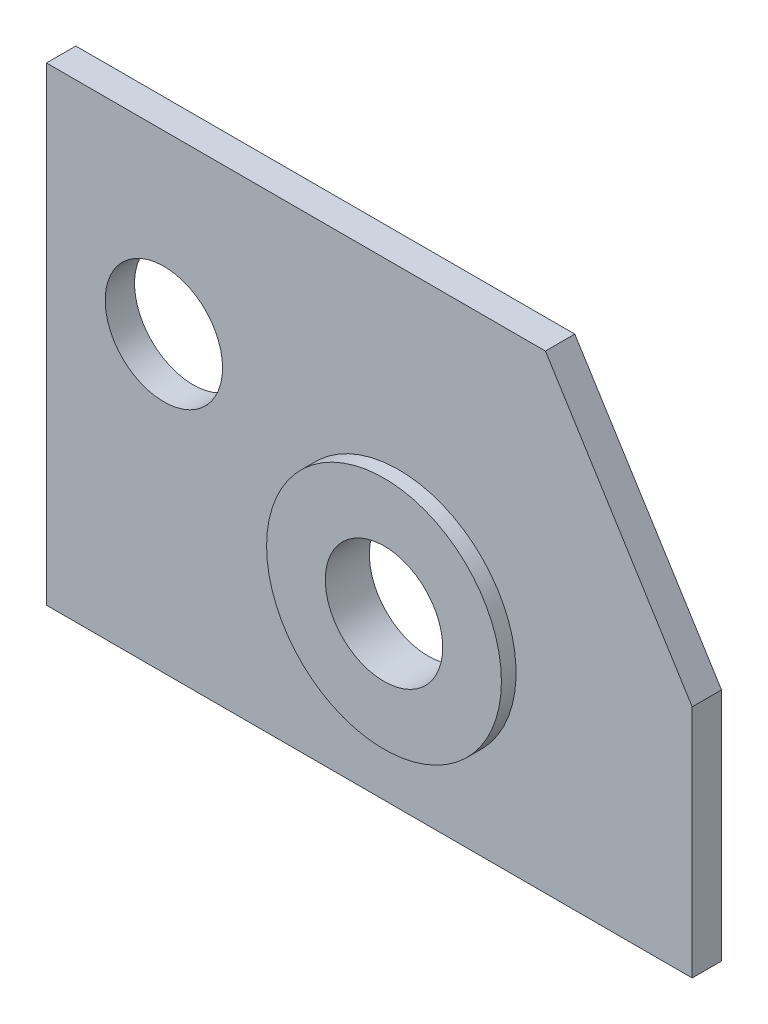
ISO-10303-21;
HEADER;
FILE_DESCRIPTION(('STEP AP214'),'2;1');
FILE_NAME('part.step','',(''),(''),'','','');
FILE_SCHEMA(('AUTOMOTIVE_DESIGN { 1 0 10303 214 1 1 1 1 }'));
ENDSEC;
DATA;
#1=APPLICATION_CONTEXT('core data for automotive mechanical design processes');
#2=APPLICATION_PROTOCOL_DEFINITION('international standard','automotive_design',2000,#1);
#3=PRODUCT_CONTEXT('',#1,'mechanical');
#4=PRODUCT('Part','Part','',(#3));
#5=PRODUCT_RELATED_PRODUCT_CATEGORY('part','',(#4));
#6=PRODUCT_DEFINITION_FORMATION('','',#4);
#7=PRODUCT_DEFINITION_CONTEXT('part definition',#1,'design');
#8=PRODUCT_DEFINITION('design','',#6,#7);
#9=PRODUCT_DEFINITION_SHAPE('','',#8);
#10=(LENGTH_UNIT() NAMED_UNIT(*) SI_UNIT(.MILLI.,.METRE.));
#11=(NAMED_UNIT(*) PLANE_ANGLE_UNIT() SI_UNIT($,.RADIAN.));
#12=(NAMED_UNIT(*) SI_UNIT($,.STERADIAN.) SOLID_ANGLE_UNIT());
#13=UNCERTAINTY_MEASURE_WITH_UNIT(LENGTH_MEASURE(1.E-05),#10,'distance_accuracy_value','');
#14=(GEOMETRIC_REPRESENTATION_CONTEXT(3) GLOBAL_UNCERTAINTY_ASSIGNED_CONTEXT((#13)) GLOBAL_UNIT_ASSIGNED_CONTEXT((#10,
#11,#12)) REPRESENTATION_CONTEXT('',''));
#15=CARTESIAN_POINT('',(0.,0.,0.));
#16=DIRECTION('',(0.,0.,1.));
#17=DIRECTION('',(1.,0.,0.));
#18=AXIS2_PLACEMENT_3D('',#15,#16,#17);
#19=CARTESIAN_POINT('',(139.7,0.,6.35));
#20=DIRECTION('',(-1.,0.,0.));
#21=DIRECTION('',(0.,0.,1.));
#22=AXIS2_PLACEMENT_3D('',#19,#20,#21);
#23=PLANE('',#22);
#24=DIRECTION('',(0.,0.,-1.));
#25=VECTOR('',#24,1.);
#26=CARTESIAN_POINT('',(139.7,50.8,230.356689222457));
#27=LINE('',#26,#25);
#28=CARTESIAN_POINT('',(139.7,50.8,6.34999999999999));
#29=VERTEX_POINT('',#28);
#30=CARTESIAN_POINT('',(139.7,50.8,0.));
#31=VERTEX_POINT('',#30);
#32=EDGE_CURVE('E48',#29,#31,#27,.T.);
#33=ORIENTED_EDGE('',*,*,#32,.F.);
#34=DIRECTION('',(0.,1.,0.));
#35=VECTOR('',#34,1.);
#36=CARTESIAN_POINT('',(139.7,0.,6.35));
#37=LINE('',#36,#35);
#38=CARTESIAN_POINT('',(139.7,0.,6.35));
#39=VERTEX_POINT('',#38);
#40=EDGE_CURVE('E96',#39,#29,#37,.T.);
#41=ORIENTED_EDGE('',*,*,#40,.F.);
#42=DIRECTION('',(0.,0.,-1.));
#43=VECTOR('',#42,1.);
#44=CARTESIAN_POINT('',(139.7,0.,6.35));
#45=LINE('',#44,#43);
#46=CARTESIAN_POINT('',(139.7,0.,0.));
#47=VERTEX_POINT('',#46);
#48=EDGE_CURVE('E103',#39,#47,#45,.T.);
#49=ORIENTED_EDGE('',*,*,#48,.T.);
#50=DIRECTION('',(0.,1.,0.));
#51=VECTOR('',#50,1.);
#52=CARTESIAN_POINT('',(139.7,0.,0.));
#53=LINE('',#52,#51);
#54=EDGE_CURVE('E112',#47,#31,#53,.T.);
#55=ORIENTED_EDGE('',*,*,#54,.T.);
#56=EDGE_LOOP('',(#33,#41,#49,#55));
#57=FACE_BOUND('',#56,.T.);
#58=ADVANCED_FACE('F33',(#57),#23,.F.);
#59=CARTESIAN_POINT('',(0.,0.,6.35));
#60=DIRECTION('',(0.,0.,-1.));
#61=DIRECTION('',(-1.,0.,0.));
#62=AXIS2_PLACEMENT_3D('',#59,#60,#61);
#63=PLANE('',#62);
#64=CARTESIAN_POINT('',(76.2,38.1,6.35));
#65=DIRECTION('',(0.,0.,-1.));
#66=DIRECTION('',(-1.,0.,0.));
#67=AXIS2_PLACEMENT_3D('',#64,#65,#66);
#68=CIRCLE('',#67,25.4);
#69=CARTESIAN_POINT('',(50.8,38.1,6.35));
#70=VERTEX_POINT('',#69);
#71=EDGE_CURVE('E11',#70,#70,#68,.F.);
#72=ORIENTED_EDGE('',*,*,#71,.F.);
#73=EDGE_LOOP('',(#72));
#74=FACE_BOUND('',#73,.T.);
#75=CARTESIAN_POINT('',(25.4,63.5,6.35));
#76=DIRECTION('',(0.,0.,1.));
#77=DIRECTION('',(1.,0.,0.));
#78=AXIS2_PLACEMENT_3D('',#75,#76,#77);
#79=CIRCLE('',#78,12.7);
#80=CARTESIAN_POINT('',(38.1,63.5,6.35));
#81=VERTEX_POINT('',#80);
#82=EDGE_CURVE('E133',#81,#81,#79,.T.);
#83=ORIENTED_EDGE('',*,*,#82,.F.);
#84=EDGE_LOOP('',(#83));
#85=FACE_BOUND('',#84,.T.);
#86=DIRECTION('',(0.52999894000318,-0.847998304005088,0.));
#87=VECTOR('',#86,1.);
#88=CARTESIAN_POINT('',(123.289887640449,77.0561797752809,6.35));
#89=LINE('',#88,#87);
#90=CARTESIAN_POINT('',(107.95,101.6,6.34999999999999));
#91=VERTEX_POINT('',#90);
#92=EDGE_CURVE('E90',#91,#29,#89,.T.);
#93=ORIENTED_EDGE('',*,*,#92,.F.);
#94=DIRECTION('',(-1.,0.,0.));
#95=VECTOR('',#94,1.);
#96=CARTESIAN_POINT('',(0.,101.6,6.35));
#97=LINE('',#96,#95);
#98=CARTESIAN_POINT('',(0.,101.6,6.35));
#99=VERTEX_POINT('',#98);
#100=EDGE_CURVE('E57',#91,#99,#97,.T.);
#101=ORIENTED_EDGE('',*,*,#100,.T.);
#102=DIRECTION('',(0.,-1.,0.));
#103=VECTOR('',#102,1.);
#104=CARTESIAN_POINT('',(0.,0.,6.35));
#105=LINE('',#104,#103);
#106=CARTESIAN_POINT('',(0.,0.,6.35));
#107=VERTEX_POINT('',#106);
#108=EDGE_CURVE('E115',#99,#107,#105,.T.);
#109=ORIENTED_EDGE('',*,*,#108,.T.);
#110=DIRECTION('',(1.,0.,0.));
#111=VECTOR('',#110,1.);
#112=CARTESIAN_POINT('',(0.,0.,6.35));
#113=LINE('',#112,#111);
#114=EDGE_CURVE('E81',#107,#39,#113,.T.);
#115=ORIENTED_EDGE('',*,*,#114,.T.);
#116=ORIENTED_EDGE('',*,*,#40,.T.);
#117=EDGE_LOOP('',(#93,#101,#109,#115,#116));
#118=FACE_BOUND('',#117,.T.);
#119=ADVANCED_FACE('F94',(#74,#85,#118),#63,.F.);
#120=CARTESIAN_POINT('',(0.,0.,0.));
#121=DIRECTION('',(0.,0.,-1.));
#122=DIRECTION('',(-1.,0.,0.));
#123=AXIS2_PLACEMENT_3D('',#120,#121,#122);
#124=PLANE('',#123);
#125=CARTESIAN_POINT('',(76.2,38.1,0.));
#126=DIRECTION('',(0.,0.,1.));
#127=DIRECTION('',(1.,0.,0.));
#128=AXIS2_PLACEMENT_3D('',#125,#126,#127);
#129=CIRCLE('',#128,12.7);
#130=CARTESIAN_POINT('',(88.9,38.1,0.));
#131=VERTEX_POINT('',#130);
#132=EDGE_CURVE('E139',#131,#131,#129,.T.);
#133=ORIENTED_EDGE('',*,*,#132,.T.);
#134=EDGE_LOOP('',(#133));
#135=FACE_BOUND('',#134,.T.);
#136=CARTESIAN_POINT('',(25.4,63.5,0.));
#137=DIRECTION('',(0.,0.,1.));
#138=DIRECTION('',(1.,0.,0.));
#139=AXIS2_PLACEMENT_3D('',#136,#137,#138);
#140=CIRCLE('',#139,12.7);
#141=CARTESIAN_POINT('',(38.1,63.5,0.));
#142=VERTEX_POINT('',#141);
#143=EDGE_CURVE('E91',#142,#142,#140,.T.);
#144=ORIENTED_EDGE('',*,*,#143,.T.);
#145=EDGE_LOOP('',(#144));
#146=FACE_BOUND('',#145,.T.);
#147=DIRECTION('',(-1.,0.,0.));
#148=VECTOR('',#147,1.);
#149=CARTESIAN_POINT('',(0.,101.6,0.));
#150=LINE('',#149,#148);
#151=CARTESIAN_POINT('',(107.95,101.6,0.));
#152=VERTEX_POINT('',#151);
#153=CARTESIAN_POINT('',(0.,101.6,0.));
#154=VERTEX_POINT('',#153);
#155=EDGE_CURVE('E75',#152,#154,#150,.T.);
#156=ORIENTED_EDGE('',*,*,#155,.F.);
#157=DIRECTION('',(0.52999894000318,-0.847998304005088,0.));
#158=VECTOR('',#157,1.);
#159=CARTESIAN_POINT('',(123.289887640449,77.0561797752809,0.));
#160=LINE('',#159,#158);
#161=EDGE_CURVE('E41',#152,#31,#160,.T.);
#162=ORIENTED_EDGE('',*,*,#161,.T.);
#163=ORIENTED_EDGE('',*,*,#54,.F.);
#164=DIRECTION('',(1.,0.,0.));
#165=VECTOR('',#164,1.);
#166=CARTESIAN_POINT('',(0.,0.,0.));
#167=LINE('',#166,#165);
#168=CARTESIAN_POINT('',(0.,0.,0.));
#169=VERTEX_POINT('',#168);
#170=EDGE_CURVE('E110',#169,#47,#167,.T.);
#171=ORIENTED_EDGE('',*,*,#170,.F.);
#172=DIRECTION('',(0.,-1.,0.));
#173=VECTOR('',#172,1.);
#174=CARTESIAN_POINT('',(0.,0.,0.));
#175=LINE('',#174,#173);
#176=EDGE_CURVE('E97',#154,#169,#175,.T.);
#177=ORIENTED_EDGE('',*,*,#176,.F.);
#178=EDGE_LOOP('',(#156,#162,#163,#171,#177));
#179=FACE_BOUND('',#178,.T.);
#180=ADVANCED_FACE('F122',(#135,#146,#179),#124,.T.);
#181=CARTESIAN_POINT('',(0.,0.,6.35));
#182=DIRECTION('',(1.,0.,0.));
#183=DIRECTION('',(0.,0.,-1.));
#184=AXIS2_PLACEMENT_3D('',#181,#182,#183);
#185=PLANE('',#184);
#186=ORIENTED_EDGE('',*,*,#176,.T.);
#187=DIRECTION('',(0.,0.,-1.));
#188=VECTOR('',#187,1.);
#189=CARTESIAN_POINT('',(0.,0.,6.35));
#190=LINE('',#189,#188);
#191=EDGE_CURVE('E119',#107,#169,#190,.T.);
#192=ORIENTED_EDGE('',*,*,#191,.F.);
#193=ORIENTED_EDGE('',*,*,#108,.F.);
#194=DIRECTION('',(0.,0.,-1.));
#195=VECTOR('',#194,1.);
#196=CARTESIAN_POINT('',(0.,101.6,6.35));
#197=LINE('',#196,#195);
#198=EDGE_CURVE('E100',#99,#154,#197,.T.);
#199=ORIENTED_EDGE('',*,*,#198,.T.);
#200=EDGE_LOOP('',(#186,#192,#193,#199));
#201=FACE_BOUND('',#200,.T.);
#202=ADVANCED_FACE('F35',(#201),#185,.F.);
#203=CARTESIAN_POINT('',(0.,0.,6.35));
#204=DIRECTION('',(0.,1.,0.));
#205=DIRECTION('',(0.,0.,1.));
#206=AXIS2_PLACEMENT_3D('',#203,#204,#205);
#207=PLANE('',#206);
#208=ORIENTED_EDGE('',*,*,#170,.T.);
#209=ORIENTED_EDGE('',*,*,#48,.F.);
#210=ORIENTED_EDGE('',*,*,#114,.F.);
#211=ORIENTED_EDGE('',*,*,#191,.T.);
#212=EDGE_LOOP('',(#208,#209,#210,#211));
#213=FACE_BOUND('',#212,.T.);
#214=ADVANCED_FACE('F125',(#213),#207,.F.);
#215=CARTESIAN_POINT('',(0.,101.6,6.35));
#216=DIRECTION('',(0.,-1.,0.));
#217=DIRECTION('',(0.,0.,-1.));
#218=AXIS2_PLACEMENT_3D('',#215,#216,#217);
#219=PLANE('',#218);
#220=ORIENTED_EDGE('',*,*,#100,.F.);
#221=DIRECTION('',(0.,0.,-1.));
#222=VECTOR('',#221,1.);
#223=CARTESIAN_POINT('',(107.95,101.6,230.356689222457));
#224=LINE('',#223,#222);
#225=EDGE_CURVE('E88',#91,#152,#224,.T.);
#226=ORIENTED_EDGE('',*,*,#225,.T.);
#227=ORIENTED_EDGE('',*,*,#155,.T.);
#228=ORIENTED_EDGE('',*,*,#198,.F.);
#229=EDGE_LOOP('',(#220,#226,#227,#228));
#230=FACE_BOUND('',#229,.T.);
#231=ADVANCED_FACE('F99',(#230),#219,.F.);
#232=CARTESIAN_POINT('',(107.95,101.6,230.356689222457));
#233=DIRECTION('',(0.847998304005088,0.52999894000318,0.));
#234=DIRECTION('',(-0.52999894000318,0.847998304005088,0.));
#235=AXIS2_PLACEMENT_3D('',#232,#233,#234);
#236=PLANE('',#235);
#237=ORIENTED_EDGE('',*,*,#225,.F.);
#238=ORIENTED_EDGE('',*,*,#92,.T.);
#239=ORIENTED_EDGE('',*,*,#32,.T.);
#240=ORIENTED_EDGE('',*,*,#161,.F.);
#241=EDGE_LOOP('',(#237,#238,#239,#240));
#242=FACE_BOUND('',#241,.T.);
#243=ADVANCED_FACE('F89',(#242),#236,.T.);
#244=CARTESIAN_POINT('',(25.4,63.5,6.35));
#245=DIRECTION('',(0.,0.,1.));
#246=DIRECTION('',(1.,0.,0.));
#247=AXIS2_PLACEMENT_3D('',#244,#245,#246);
#248=CYLINDRICAL_SURFACE('',#247,12.7);
#249=ORIENTED_EDGE('',*,*,#143,.F.);
#250=EDGE_LOOP('',(#249));
#251=FACE_BOUND('',#250,.T.);
#252=ORIENTED_EDGE('',*,*,#82,.T.);
#253=EDGE_LOOP('',(#252));
#254=FACE_BOUND('',#253,.T.);
#255=ADVANCED_FACE('F163',(#251,#254),#248,.F.);
#256=CARTESIAN_POINT('',(76.2,38.1,9.525));
#257=DIRECTION('',(0.,0.,-1.));
#258=DIRECTION('',(-1.,0.,0.));
#259=AXIS2_PLACEMENT_3D('',#256,#257,#258);
#260=CYLINDRICAL_SURFACE('',#259,25.4);
#261=CARTESIAN_POINT('',(76.2,38.1,9.525));
#262=DIRECTION('',(0.,0.,1.));
#263=DIRECTION('',(1.,0.,0.));
#264=AXIS2_PLACEMENT_3D('',#261,#262,#263);
#265=CIRCLE('',#264,25.4);
#266=CARTESIAN_POINT('',(101.6,38.1,9.525));
#267=VERTEX_POINT('',#266);
#268=EDGE_CURVE('E136',#267,#267,#265,.T.);
#269=ORIENTED_EDGE('',*,*,#268,.F.);
#270=EDGE_LOOP('',(#269));
#271=FACE_BOUND('',#270,.T.);
#272=ORIENTED_EDGE('',*,*,#71,.T.);
#273=EDGE_LOOP('',(#272));
#274=FACE_BOUND('',#273,.T.);
#275=ADVANCED_FACE('F157',(#271,#274),#260,.T.);
#276=CARTESIAN_POINT('',(76.2,38.1,9.525));
#277=DIRECTION('',(0.,0.,1.));
#278=DIRECTION('',(1.,0.,0.));
#279=AXIS2_PLACEMENT_3D('',#276,#277,#278);
#280=PLANE('',#279);
#281=CARTESIAN_POINT('',(76.2,38.1,9.525));
#282=DIRECTION('',(0.,0.,1.));
#283=DIRECTION('',(1.,0.,0.));
#284=AXIS2_PLACEMENT_3D('',#281,#282,#283);
#285=CIRCLE('',#284,12.7);
#286=CARTESIAN_POINT('',(88.9,38.1,9.525));
#287=VERTEX_POINT('',#286);
#288=EDGE_CURVE('E140',#287,#287,#285,.T.);
#289=ORIENTED_EDGE('',*,*,#288,.F.);
#290=EDGE_LOOP('',(#289));
#291=FACE_BOUND('',#290,.T.);
#292=ORIENTED_EDGE('',*,*,#268,.T.);
#293=EDGE_LOOP('',(#292));
#294=FACE_BOUND('',#293,.T.);
#295=ADVANCED_FACE('F151',(#291,#294),#280,.T.);
#296=CARTESIAN_POINT('',(76.2,38.1,0.));
#297=DIRECTION('',(0.,0.,1.));
#298=DIRECTION('',(1.,0.,0.));
#299=AXIS2_PLACEMENT_3D('',#296,#297,#298);
#300=CYLINDRICAL_SURFACE('',#299,12.7);
#301=ORIENTED_EDGE('',*,*,#132,.F.);
#302=EDGE_LOOP('',(#301));
#303=FACE_BOUND('',#302,.T.);
#304=ORIENTED_EDGE('',*,*,#288,.T.);
#305=EDGE_LOOP('',(#304));
#306=FACE_BOUND('',#305,.T.);
#307=ADVANCED_FACE('F148',(#303,#306),#300,.F.);
#308=CLOSED_SHELL('',(#58,#119,#180,#202,#214,#231,#243,#255,#275,#295,#307));
#309=MANIFOLD_SOLID_BREP('B2',#308);
#310=ADVANCED_BREP_SHAPE_REPRESENTATION('',(#18,#309),#14);
#311=SHAPE_DEFINITION_REPRESENTATION(#9,#310);
ENDSEC;
END-ISO-10303-21;
